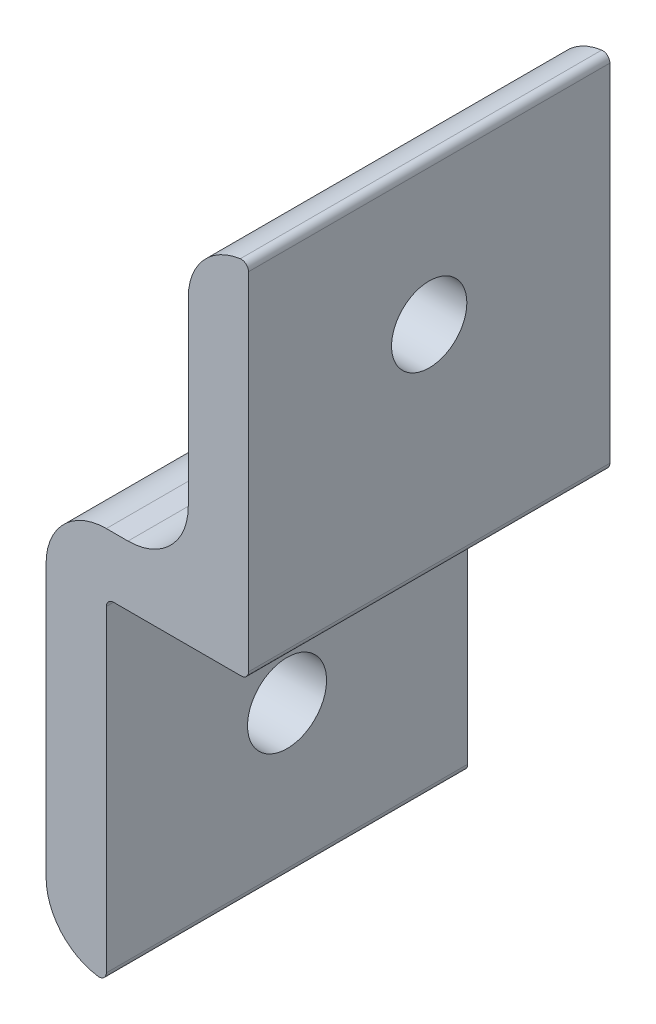
ISO-10303-21;
HEADER;
FILE_DESCRIPTION(('STEP AP214'),'2;1');
FILE_NAME('part.step','',(''),(''),'','','');
FILE_SCHEMA(('AUTOMOTIVE_DESIGN { 1 0 10303 214 1 1 1 1 }'));
ENDSEC;
DATA;
#1=APPLICATION_CONTEXT('core data for automotive mechanical design processes');
#2=APPLICATION_PROTOCOL_DEFINITION('international standard','automotive_design',2000,#1);
#3=PRODUCT_CONTEXT('',#1,'mechanical');
#4=PRODUCT('Part','Part','',(#3));
#5=PRODUCT_RELATED_PRODUCT_CATEGORY('part','',(#4));
#6=PRODUCT_DEFINITION_FORMATION('','',#4);
#7=PRODUCT_DEFINITION_CONTEXT('part definition',#1,'design');
#8=PRODUCT_DEFINITION('design','',#6,#7);
#9=PRODUCT_DEFINITION_SHAPE('','',#8);
#10=(LENGTH_UNIT() NAMED_UNIT(*) SI_UNIT(.MILLI.,.METRE.));
#11=(NAMED_UNIT(*) PLANE_ANGLE_UNIT() SI_UNIT($,.RADIAN.));
#12=(NAMED_UNIT(*) SI_UNIT($,.STERADIAN.) SOLID_ANGLE_UNIT());
#13=UNCERTAINTY_MEASURE_WITH_UNIT(LENGTH_MEASURE(1.E-05),#10,'distance_accuracy_value','');
#14=(GEOMETRIC_REPRESENTATION_CONTEXT(3) GLOBAL_UNCERTAINTY_ASSIGNED_CONTEXT((#13)) GLOBAL_UNIT_ASSIGNED_CONTEXT((#10,
#11,#12)) REPRESENTATION_CONTEXT('',''));
#15=CARTESIAN_POINT('',(0.,0.,0.));
#16=DIRECTION('',(0.,0.,1.));
#17=DIRECTION('',(1.,0.,0.));
#18=AXIS2_PLACEMENT_3D('',#15,#16,#17);
#19=CARTESIAN_POINT('',(-21.0747321003927,-66.5367807697173,38.1));
#20=DIRECTION('',(-1.,0.,0.));
#21=DIRECTION('',(0.,-1.,0.));
#22=AXIS2_PLACEMENT_3D('',#19,#20,#21);
#23=PLANE('',#22);
#24=CARTESIAN_POINT('',(-21.0747321003927,-56.9635207697173,19.05));
#25=DIRECTION('',(-1.,0.,0.));
#26=DIRECTION('',(0.,0.,1.));
#27=AXIS2_PLACEMENT_3D('',#24,#25,#26);
#28=CIRCLE('',#27,4.16560000000001);
#29=CARTESIAN_POINT('',(-21.0747321003927,-56.9635207697173,23.2156));
#30=VERTEX_POINT('',#29);
#31=EDGE_CURVE('E319',#30,#30,#28,.T.);
#32=ORIENTED_EDGE('',*,*,#31,.F.);
#33=EDGE_LOOP('',(#32));
#34=FACE_BOUND('',#33,.T.);
#35=DIRECTION('',(0.,1.,0.));
#36=VECTOR('',#35,1.);
#37=CARTESIAN_POINT('',(-21.0747321003927,-66.5367807697173,38.1));
#38=LINE('',#37,#36);
#39=CARTESIAN_POINT('',(-21.0747321003926,-66.5367807697173,38.1));
#40=VERTEX_POINT('',#39);
#41=CARTESIAN_POINT('',(-21.0747321003927,-37.8601807697173,38.1));
#42=VERTEX_POINT('',#41);
#43=EDGE_CURVE('E232',#40,#42,#38,.T.);
#44=ORIENTED_EDGE('',*,*,#43,.T.);
#45=DIRECTION('',(0.,0.,-1.));
#46=VECTOR('',#45,1.);
#47=CARTESIAN_POINT('',(-21.0747321003927,-37.8601807697173,38.1));
#48=LINE('',#47,#46);
#49=CARTESIAN_POINT('',(-21.0747321003926,-37.8601807697173,0.));
#50=VERTEX_POINT('',#49);
#51=EDGE_CURVE('E288',#42,#50,#48,.T.);
#52=ORIENTED_EDGE('',*,*,#51,.T.);
#53=DIRECTION('',(0.,1.,0.));
#54=VECTOR('',#53,1.);
#55=CARTESIAN_POINT('',(-21.0747321003927,-66.5367807697173,0.));
#56=LINE('',#55,#54);
#57=CARTESIAN_POINT('',(-21.0747321003926,-66.5367807697173,0.));
#58=VERTEX_POINT('',#57);
#59=EDGE_CURVE('E206',#58,#50,#56,.T.);
#60=ORIENTED_EDGE('',*,*,#59,.F.);
#61=DIRECTION('',(0.,0.,-1.));
#62=VECTOR('',#61,1.);
#63=CARTESIAN_POINT('',(-21.0747321003926,-66.5367807697173,38.1));
#64=LINE('',#63,#62);
#65=EDGE_CURVE('E181',#40,#58,#64,.T.);
#66=ORIENTED_EDGE('',*,*,#65,.F.);
#67=EDGE_LOOP('',(#44,#52,#60,#66));
#68=FACE_BOUND('',#67,.T.);
#69=ADVANCED_FACE('F38',(#34,#68),#23,.T.);
#70=CARTESIAN_POINT('',(-14.7247321003927,-66.5367807697173,38.1));
#71=DIRECTION('',(0.,0.,-1.));
#72=DIRECTION('',(0.,1.,0.));
#73=AXIS2_PLACEMENT_3D('',#70,#71,#72);
#74=CYLINDRICAL_SURFACE('',#73,6.34999999999999);
#75=CARTESIAN_POINT('',(-14.7247321003927,-66.5367807697173,0.));
#76=DIRECTION('',(0.,0.,-1.));
#77=DIRECTION('',(0.,1.,0.));
#78=AXIS2_PLACEMENT_3D('',#75,#76,#77);
#79=CIRCLE('',#78,6.34999999999999);
#80=CARTESIAN_POINT('',(-15.5906411913018,-72.8274644723271,0.));
#81=VERTEX_POINT('',#80);
#82=EDGE_CURVE('E230',#81,#58,#79,.T.);
#83=ORIENTED_EDGE('',*,*,#82,.F.);
#84=DIRECTION('',(0.,0.,-1.));
#85=VECTOR('',#84,1.);
#86=CARTESIAN_POINT('',(-15.5906411913018,-72.8274644723272,38.1));
#87=LINE('',#86,#85);
#88=CARTESIAN_POINT('',(-15.5906411913018,-72.8274644723272,38.1));
#89=VERTEX_POINT('',#88);
#90=EDGE_CURVE('E271',#81,#89,#87,.F.);
#91=ORIENTED_EDGE('',*,*,#90,.T.);
#92=CARTESIAN_POINT('',(-14.7247321003927,-66.5367807697173,38.1));
#93=DIRECTION('',(0.,0.,-1.));
#94=DIRECTION('',(0.,1.,0.));
#95=AXIS2_PLACEMENT_3D('',#92,#93,#94);
#96=CIRCLE('',#95,6.34999999999999);
#97=EDGE_CURVE('E182',#89,#40,#96,.T.);
#98=ORIENTED_EDGE('',*,*,#97,.T.);
#99=ORIENTED_EDGE('',*,*,#65,.T.);
#100=EDGE_LOOP('',(#83,#91,#98,#99));
#101=FACE_BOUND('',#100,.T.);
#102=ADVANCED_FACE('F328',(#101),#74,.T.);
#103=CARTESIAN_POINT('',(-14.7247321003927,-37.8601807697173,38.1));
#104=DIRECTION('',(1.,0.,0.));
#105=DIRECTION('',(0.,1.,0.));
#106=AXIS2_PLACEMENT_3D('',#103,#104,#105);
#107=PLANE('',#106);
#108=CARTESIAN_POINT('',(-14.7247321003927,-56.9635207697173,19.05));
#109=DIRECTION('',(1.,0.,0.));
#110=DIRECTION('',(0.,1.,0.));
#111=AXIS2_PLACEMENT_3D('',#108,#109,#110);
#112=CIRCLE('',#111,4.16560000000001);
#113=CARTESIAN_POINT('',(-14.7247321003927,-52.7979207697173,19.05));
#114=VERTEX_POINT('',#113);
#115=EDGE_CURVE('E315',#114,#114,#112,.T.);
#116=ORIENTED_EDGE('',*,*,#115,.F.);
#117=EDGE_LOOP('',(#116));
#118=FACE_BOUND('',#117,.T.);
#119=DIRECTION('',(0.,-1.,0.));
#120=VECTOR('',#119,1.);
#121=CARTESIAN_POINT('',(-14.7247321003927,-37.8601807697173,0.));
#122=LINE('',#121,#120);
#123=CARTESIAN_POINT('',(-14.7247321003927,-38.6221807697173,0.));
#124=VERTEX_POINT('',#123);
#125=CARTESIAN_POINT('',(-14.7247321003927,-72.0725824280139,0.));
#126=VERTEX_POINT('',#125);
#127=EDGE_CURVE('E226',#124,#126,#122,.T.);
#128=ORIENTED_EDGE('',*,*,#127,.F.);
#129=DIRECTION('',(0.,0.,-1.));
#130=VECTOR('',#129,1.);
#131=CARTESIAN_POINT('',(-14.7247321003927,-38.6221807697173,38.1));
#132=LINE('',#131,#130);
#133=CARTESIAN_POINT('',(-14.7247321003927,-38.6221807697173,38.1));
#134=VERTEX_POINT('',#133);
#135=EDGE_CURVE('E268',#124,#134,#132,.F.);
#136=ORIENTED_EDGE('',*,*,#135,.T.);
#137=DIRECTION('',(0.,-1.,0.));
#138=VECTOR('',#137,1.);
#139=CARTESIAN_POINT('',(-14.7247321003927,-37.8601807697173,38.1));
#140=LINE('',#139,#138);
#141=CARTESIAN_POINT('',(-14.7247321003927,-72.072582428014,38.1));
#142=VERTEX_POINT('',#141);
#143=EDGE_CURVE('E201',#134,#142,#140,.T.);
#144=ORIENTED_EDGE('',*,*,#143,.T.);
#145=DIRECTION('',(0.,0.,-1.));
#146=VECTOR('',#145,1.);
#147=CARTESIAN_POINT('',(-14.7247321003927,-72.072582428014,38.1));
#148=LINE('',#147,#146);
#149=EDGE_CURVE('E265',#142,#126,#148,.T.);
#150=ORIENTED_EDGE('',*,*,#149,.T.);
#151=EDGE_LOOP('',(#128,#136,#144,#150));
#152=FACE_BOUND('',#151,.T.);
#153=ADVANCED_FACE('F370',(#118,#152),#107,.T.);
#154=CARTESIAN_POINT('',(0.261267899607333,-37.8601807697173,38.1));
#155=DIRECTION('',(0.,-1.,0.));
#156=DIRECTION('',(0.,0.,-1.));
#157=AXIS2_PLACEMENT_3D('',#154,#155,#156);
#158=PLANE('',#157);
#159=DIRECTION('',(-1.,0.,0.));
#160=VECTOR('',#159,1.);
#161=CARTESIAN_POINT('',(0.261267899607336,-37.8601807697173,0.));
#162=LINE('',#161,#160);
#163=CARTESIAN_POINT('',(-0.500732100392664,-37.8601807697173,0.));
#164=VERTEX_POINT('',#163);
#165=CARTESIAN_POINT('',(-13.9627321003927,-37.8601807697173,0.));
#166=VERTEX_POINT('',#165);
#167=EDGE_CURVE('E222',#164,#166,#162,.T.);
#168=ORIENTED_EDGE('',*,*,#167,.F.);
#169=DIRECTION('',(0.,0.,-1.));
#170=VECTOR('',#169,1.);
#171=CARTESIAN_POINT('',(-0.500732100392667,-37.8601807697173,38.1));
#172=LINE('',#171,#170);
#173=CARTESIAN_POINT('',(-0.500732100392667,-37.8601807697173,38.1));
#174=VERTEX_POINT('',#173);
#175=EDGE_CURVE('E253',#164,#174,#172,.F.);
#176=ORIENTED_EDGE('',*,*,#175,.T.);
#177=DIRECTION('',(-1.,0.,0.));
#178=VECTOR('',#177,1.);
#179=CARTESIAN_POINT('',(0.261267899607333,-37.8601807697173,38.1));
#180=LINE('',#179,#178);
#181=CARTESIAN_POINT('',(-13.9627321003927,-37.8601807697173,38.1));
#182=VERTEX_POINT('',#181);
#183=EDGE_CURVE('E194',#174,#182,#180,.T.);
#184=ORIENTED_EDGE('',*,*,#183,.T.);
#185=DIRECTION('',(0.,0.,-1.));
#186=VECTOR('',#185,1.);
#187=CARTESIAN_POINT('',(-13.9627321003927,-37.8601807697173,0.));
#188=LINE('',#187,#186);
#189=EDGE_CURVE('E249',#182,#166,#188,.T.);
#190=ORIENTED_EDGE('',*,*,#189,.T.);
#191=EDGE_LOOP('',(#168,#176,#184,#190));
#192=FACE_BOUND('',#191,.T.);
#193=ADVANCED_FACE('F366',(#192),#158,.T.);
#194=CARTESIAN_POINT('',(0.261267899607339,0.2398192302827,38.1));
#195=DIRECTION('',(1.,0.,0.));
#196=DIRECTION('',(0.,1.,0.));
#197=AXIS2_PLACEMENT_3D('',#194,#195,#196);
#198=PLANE('',#197);
#199=CARTESIAN_POINT('',(0.261267899607339,-14.9062007697173,19.05));
#200=DIRECTION('',(1.,0.,0.));
#201=DIRECTION('',(0.,0.,-1.));
#202=AXIS2_PLACEMENT_3D('',#199,#200,#201);
#203=CIRCLE('',#202,3.96874999999999);
#204=CARTESIAN_POINT('',(0.261267899607339,-14.9062007697173,15.08125));
#205=VERTEX_POINT('',#204);
#206=EDGE_CURVE('E311',#205,#205,#203,.T.);
#207=ORIENTED_EDGE('',*,*,#206,.F.);
#208=EDGE_LOOP('',(#207));
#209=FACE_BOUND('',#208,.T.);
#210=DIRECTION('',(0.,-1.,0.));
#211=VECTOR('',#210,1.);
#212=CARTESIAN_POINT('',(0.261267899607339,0.2398192302827,38.1));
#213=LINE('',#212,#211);
#214=CARTESIAN_POINT('',(0.261267899607339,-0.574379111420643,38.1));
#215=VERTEX_POINT('',#214);
#216=CARTESIAN_POINT('',(0.261267899607333,-37.0981807697173,38.1));
#217=VERTEX_POINT('',#216);
#218=EDGE_CURVE('E189',#215,#217,#213,.T.);
#219=ORIENTED_EDGE('',*,*,#218,.T.);
#220=DIRECTION('',(0.,0.,-1.));
#221=VECTOR('',#220,1.);
#222=CARTESIAN_POINT('',(0.261267899607333,-37.0981807697173,38.1));
#223=LINE('',#222,#221);
#224=CARTESIAN_POINT('',(0.261267899607336,-37.0981807697173,0.));
#225=VERTEX_POINT('',#224);
#226=EDGE_CURVE('E238',#217,#225,#223,.T.);
#227=ORIENTED_EDGE('',*,*,#226,.T.);
#228=DIRECTION('',(0.,-1.,0.));
#229=VECTOR('',#228,1.);
#230=CARTESIAN_POINT('',(0.261267899607342,0.239819230282717,0.));
#231=LINE('',#230,#229);
#232=CARTESIAN_POINT('',(0.261267899607342,-0.574379111420627,0.));
#233=VERTEX_POINT('',#232);
#234=EDGE_CURVE('E218',#233,#225,#231,.T.);
#235=ORIENTED_EDGE('',*,*,#234,.F.);
#236=DIRECTION('',(0.,0.,-1.));
#237=VECTOR('',#236,1.);
#238=CARTESIAN_POINT('',(0.261267899607339,-0.574379111420643,38.1));
#239=LINE('',#238,#237);
#240=EDGE_CURVE('E234',#233,#215,#239,.F.);
#241=ORIENTED_EDGE('',*,*,#240,.T.);
#242=EDGE_LOOP('',(#219,#227,#235,#241));
#243=FACE_BOUND('',#242,.T.);
#244=ADVANCED_FACE('F363',(#209,#243),#198,.T.);
#245=CARTESIAN_POINT('',(0.261267899607341,-6.1101807697173,38.1));
#246=DIRECTION('',(0.,0.,-1.));
#247=DIRECTION('',(0.,1.,0.));
#248=AXIS2_PLACEMENT_3D('',#245,#246,#247);
#249=CYLINDRICAL_SURFACE('',#248,6.35);
#250=CARTESIAN_POINT('',(0.261267899607341,-6.1101807697173,38.1));
#251=DIRECTION('',(0.,0.,-1.));
#252=DIRECTION('',(0.,1.,0.));
#253=AXIS2_PLACEMENT_3D('',#250,#251,#252);
#254=CIRCLE('',#253,6.35);
#255=CARTESIAN_POINT('',(-6.08873210039266,-6.1101807697173,38.1));
#256=VERTEX_POINT('',#255);
#257=CARTESIAN_POINT('',(-0.604641191301752,0.180502932892537,38.1));
#258=VERTEX_POINT('',#257);
#259=EDGE_CURVE('E170',#256,#258,#254,.T.);
#260=ORIENTED_EDGE('',*,*,#259,.T.);
#261=DIRECTION('',(0.,0.,-1.));
#262=VECTOR('',#261,1.);
#263=CARTESIAN_POINT('',(-0.604641191301753,0.180502932892538,38.1));
#264=LINE('',#263,#262);
#265=CARTESIAN_POINT('',(-0.60464119130175,0.180502932892555,0.));
#266=VERTEX_POINT('',#265);
#267=EDGE_CURVE('E262',#258,#266,#264,.T.);
#268=ORIENTED_EDGE('',*,*,#267,.T.);
#269=CARTESIAN_POINT('',(0.261267899607344,-6.11018076971728,0.));
#270=DIRECTION('',(0.,0.,-1.));
#271=DIRECTION('',(0.,1.,0.));
#272=AXIS2_PLACEMENT_3D('',#269,#270,#271);
#273=CIRCLE('',#272,6.35);
#274=CARTESIAN_POINT('',(-6.08873210039266,-6.11018076971728,0.));
#275=VERTEX_POINT('',#274);
#276=EDGE_CURVE('E179',#275,#266,#273,.T.);
#277=ORIENTED_EDGE('',*,*,#276,.F.);
#278=DIRECTION('',(0.,0.,-1.));
#279=VECTOR('',#278,1.);
#280=CARTESIAN_POINT('',(-6.08873210039266,-6.1101807697173,38.1));
#281=LINE('',#280,#279);
#282=EDGE_CURVE('E163',#256,#275,#281,.T.);
#283=ORIENTED_EDGE('',*,*,#282,.F.);
#284=EDGE_LOOP('',(#260,#268,#277,#283));
#285=FACE_BOUND('',#284,.T.);
#286=ADVANCED_FACE('F175',(#285),#249,.T.);
#287=CARTESIAN_POINT('',(-6.08873210039266,-31.5101807697173,38.1));
#288=DIRECTION('',(-1.,0.,0.));
#289=DIRECTION('',(0.,-1.,0.));
#290=AXIS2_PLACEMENT_3D('',#287,#288,#289);
#291=PLANE('',#290);
#292=CARTESIAN_POINT('',(-6.08873210039266,-14.9062007697173,19.05));
#293=DIRECTION('',(-1.,0.,0.));
#294=DIRECTION('',(0.,-1.,0.));
#295=AXIS2_PLACEMENT_3D('',#292,#293,#294);
#296=CIRCLE('',#295,3.96874999999999);
#297=CARTESIAN_POINT('',(-6.08873210039266,-18.8749507697173,19.05));
#298=VERTEX_POINT('',#297);
#299=EDGE_CURVE('E211',#298,#298,#296,.T.);
#300=ORIENTED_EDGE('',*,*,#299,.F.);
#301=EDGE_LOOP('',(#300));
#302=FACE_BOUND('',#301,.T.);
#303=DIRECTION('',(0.,1.,0.));
#304=VECTOR('',#303,1.);
#305=CARTESIAN_POINT('',(-6.08873210039266,-31.5101807697173,0.));
#306=LINE('',#305,#304);
#307=CARTESIAN_POINT('',(-6.08873210039266,-25.1601807697173,0.));
#308=VERTEX_POINT('',#307);
#309=EDGE_CURVE('E214',#308,#275,#306,.T.);
#310=ORIENTED_EDGE('',*,*,#309,.F.);
#311=DIRECTION('',(0.,0.,-1.));
#312=VECTOR('',#311,1.);
#313=CARTESIAN_POINT('',(-6.08873210039266,-25.1601807697173,38.1));
#314=LINE('',#313,#312);
#315=CARTESIAN_POINT('',(-6.08873210039266,-25.1601807697173,38.1));
#316=VERTEX_POINT('',#315);
#317=EDGE_CURVE('E166',#308,#316,#314,.F.);
#318=ORIENTED_EDGE('',*,*,#317,.T.);
#319=DIRECTION('',(0.,1.,0.));
#320=VECTOR('',#319,1.);
#321=CARTESIAN_POINT('',(-6.08873210039266,-31.5101807697173,38.1));
#322=LINE('',#321,#320);
#323=EDGE_CURVE('E159',#316,#256,#322,.T.);
#324=ORIENTED_EDGE('',*,*,#323,.T.);
#325=ORIENTED_EDGE('',*,*,#282,.T.);
#326=EDGE_LOOP('',(#310,#318,#324,#325));
#327=FACE_BOUND('',#326,.T.);
#328=ADVANCED_FACE('F162',(#302,#327),#291,.T.);
#329=CARTESIAN_POINT('',(-21.0747321003927,-31.5101807697173,38.1));
#330=DIRECTION('',(0.,1.,0.));
#331=DIRECTION('',(0.,0.,1.));
#332=AXIS2_PLACEMENT_3D('',#329,#330,#331);
#333=PLANE('',#332);
#334=DIRECTION('',(1.,0.,0.));
#335=VECTOR('',#334,1.);
#336=CARTESIAN_POINT('',(-21.0747321003927,-31.5101807697173,38.1));
#337=LINE('',#336,#335);
#338=CARTESIAN_POINT('',(-14.7247321003927,-31.5101807697173,38.1));
#339=VERTEX_POINT('',#338);
#340=CARTESIAN_POINT('',(-12.4387321003927,-31.5101807697173,38.1));
#341=VERTEX_POINT('',#340);
#342=EDGE_CURVE('E171',#339,#341,#337,.T.);
#343=ORIENTED_EDGE('',*,*,#342,.T.);
#344=DIRECTION('',(0.,0.,-1.));
#345=VECTOR('',#344,1.);
#346=CARTESIAN_POINT('',(-12.4387321003927,-31.5101807697173,0.));
#347=LINE('',#346,#345);
#348=CARTESIAN_POINT('',(-12.4387321003927,-31.5101807697173,0.));
#349=VERTEX_POINT('',#348);
#350=EDGE_CURVE('E282',#341,#349,#347,.T.);
#351=ORIENTED_EDGE('',*,*,#350,.T.);
#352=DIRECTION('',(1.,0.,0.));
#353=VECTOR('',#352,1.);
#354=CARTESIAN_POINT('',(-21.0747321003926,-31.5101807697173,0.));
#355=LINE('',#354,#353);
#356=CARTESIAN_POINT('',(-14.7247321003927,-31.5101807697173,0.));
#357=VERTEX_POINT('',#356);
#358=EDGE_CURVE('E210',#357,#349,#355,.T.);
#359=ORIENTED_EDGE('',*,*,#358,.F.);
#360=DIRECTION('',(0.,0.,-1.));
#361=VECTOR('',#360,1.);
#362=CARTESIAN_POINT('',(-14.7247321003927,-31.5101807697173,38.1));
#363=LINE('',#362,#361);
#364=EDGE_CURVE('E279',#357,#339,#363,.F.);
#365=ORIENTED_EDGE('',*,*,#364,.T.);
#366=EDGE_LOOP('',(#343,#351,#359,#365));
#367=FACE_BOUND('',#366,.T.);
#368=ADVANCED_FACE('F304',(#367),#333,.T.);
#369=CARTESIAN_POINT('',(0.261267899607341,-6.1101807697173,38.1));
#370=DIRECTION('',(0.,0.,-1.));
#371=DIRECTION('',(0.,1.,0.));
#372=AXIS2_PLACEMENT_3D('',#369,#370,#371);
#373=PLANE('',#372);
#374=ORIENTED_EDGE('',*,*,#342,.F.);
#375=CARTESIAN_POINT('',(-14.7247321003927,-37.8601807697173,38.1));
#376=DIRECTION('',(0.,0.,-1.));
#377=DIRECTION('',(0.,1.,0.));
#378=AXIS2_PLACEMENT_3D('',#375,#376,#377);
#379=CIRCLE('',#378,6.35);
#380=EDGE_CURVE('E56',#339,#42,#379,.F.);
#381=ORIENTED_EDGE('',*,*,#380,.T.);
#382=ORIENTED_EDGE('',*,*,#43,.F.);
#383=ORIENTED_EDGE('',*,*,#97,.F.);
#384=CARTESIAN_POINT('',(-15.4867321003927,-72.072582428014,38.1));
#385=DIRECTION('',(0.,0.,-1.));
#386=DIRECTION('',(0.,1.,0.));
#387=AXIS2_PLACEMENT_3D('',#384,#385,#386);
#388=CIRCLE('',#387,0.762);
#389=EDGE_CURVE('E256',#89,#142,#388,.F.);
#390=ORIENTED_EDGE('',*,*,#389,.T.);
#391=ORIENTED_EDGE('',*,*,#143,.F.);
#392=CARTESIAN_POINT('',(-13.9627321003927,-38.6221807697173,38.1));
#393=DIRECTION('',(0.,0.,-1.));
#394=DIRECTION('',(0.,1.,0.));
#395=AXIS2_PLACEMENT_3D('',#392,#393,#394);
#396=CIRCLE('',#395,0.762);
#397=EDGE_CURVE('E276',#134,#182,#396,.T.);
#398=ORIENTED_EDGE('',*,*,#397,.T.);
#399=ORIENTED_EDGE('',*,*,#183,.F.);
#400=CARTESIAN_POINT('',(-0.500732100392667,-37.0981807697173,38.1));
#401=DIRECTION('',(0.,0.,-1.));
#402=DIRECTION('',(0.,1.,0.));
#403=AXIS2_PLACEMENT_3D('',#400,#401,#402);
#404=CIRCLE('',#403,0.762);
#405=EDGE_CURVE('E259',#174,#217,#404,.F.);
#406=ORIENTED_EDGE('',*,*,#405,.T.);
#407=ORIENTED_EDGE('',*,*,#218,.F.);
#408=CARTESIAN_POINT('',(-0.500732100392661,-0.574379111420643,38.1));
#409=DIRECTION('',(0.,0.,-1.));
#410=DIRECTION('',(0.,1.,0.));
#411=AXIS2_PLACEMENT_3D('',#408,#409,#410);
#412=CIRCLE('',#411,0.762);
#413=EDGE_CURVE('E187',#215,#258,#412,.F.);
#414=ORIENTED_EDGE('',*,*,#413,.T.);
#415=ORIENTED_EDGE('',*,*,#259,.F.);
#416=ORIENTED_EDGE('',*,*,#323,.F.);
#417=CARTESIAN_POINT('',(-12.4387321003927,-25.1601807697173,38.1));
#418=DIRECTION('',(0.,0.,-1.));
#419=DIRECTION('',(0.,1.,0.));
#420=AXIS2_PLACEMENT_3D('',#417,#418,#419);
#421=CIRCLE('',#420,6.35);
#422=EDGE_CURVE('E11',#316,#341,#421,.T.);
#423=ORIENTED_EDGE('',*,*,#422,.T.);
#424=EDGE_LOOP('',(#374,#381,#382,#383,#390,#391,#398,#399,#406,#407,#414,#415,#416,#423));
#425=FACE_BOUND('',#424,.T.);
#426=ADVANCED_FACE('F184',(#425),#373,.F.);
#427=CARTESIAN_POINT('',(0.261267899607344,-6.11018076971728,0.));
#428=DIRECTION('',(0.,0.,-1.));
#429=DIRECTION('',(0.,1.,0.));
#430=AXIS2_PLACEMENT_3D('',#427,#428,#429);
#431=PLANE('',#430);
#432=ORIENTED_EDGE('',*,*,#59,.T.);
#433=CARTESIAN_POINT('',(-14.7247321003927,-37.8601807697173,0.));
#434=DIRECTION('',(0.,0.,-1.));
#435=DIRECTION('',(0.,1.,0.));
#436=AXIS2_PLACEMENT_3D('',#433,#434,#435);
#437=CIRCLE('',#436,6.35);
#438=EDGE_CURVE('E65',#50,#357,#437,.T.);
#439=ORIENTED_EDGE('',*,*,#438,.T.);
#440=ORIENTED_EDGE('',*,*,#358,.T.);
#441=CARTESIAN_POINT('',(-12.4387321003927,-25.1601807697173,0.));
#442=DIRECTION('',(0.,0.,-1.));
#443=DIRECTION('',(0.,1.,0.));
#444=AXIS2_PLACEMENT_3D('',#441,#442,#443);
#445=CIRCLE('',#444,6.35);
#446=EDGE_CURVE('E47',#349,#308,#445,.F.);
#447=ORIENTED_EDGE('',*,*,#446,.T.);
#448=ORIENTED_EDGE('',*,*,#309,.T.);
#449=ORIENTED_EDGE('',*,*,#276,.T.);
#450=CARTESIAN_POINT('',(-0.500732100392658,-0.574379111420626,0.));
#451=DIRECTION('',(0.,0.,-1.));
#452=DIRECTION('',(0.,1.,0.));
#453=AXIS2_PLACEMENT_3D('',#450,#451,#452);
#454=CIRCLE('',#453,0.762);
#455=EDGE_CURVE('E244',#266,#233,#454,.T.);
#456=ORIENTED_EDGE('',*,*,#455,.T.);
#457=ORIENTED_EDGE('',*,*,#234,.T.);
#458=CARTESIAN_POINT('',(-0.500732100392664,-37.0981807697173,0.));
#459=DIRECTION('',(0.,0.,-1.));
#460=DIRECTION('',(0.,1.,0.));
#461=AXIS2_PLACEMENT_3D('',#458,#459,#460);
#462=CIRCLE('',#461,0.762);
#463=EDGE_CURVE('E246',#225,#164,#462,.T.);
#464=ORIENTED_EDGE('',*,*,#463,.T.);
#465=ORIENTED_EDGE('',*,*,#167,.T.);
#466=CARTESIAN_POINT('',(-13.9627321003927,-38.6221807697173,0.));
#467=DIRECTION('',(0.,0.,-1.));
#468=DIRECTION('',(0.,1.,0.));
#469=AXIS2_PLACEMENT_3D('',#466,#467,#468);
#470=CIRCLE('',#469,0.762);
#471=EDGE_CURVE('E273',#166,#124,#470,.F.);
#472=ORIENTED_EDGE('',*,*,#471,.T.);
#473=ORIENTED_EDGE('',*,*,#127,.T.);
#474=CARTESIAN_POINT('',(-15.4867321003927,-72.072582428014,0.));
#475=DIRECTION('',(0.,0.,-1.));
#476=DIRECTION('',(0.,1.,0.));
#477=AXIS2_PLACEMENT_3D('',#474,#475,#476);
#478=CIRCLE('',#477,0.762);
#479=EDGE_CURVE('E242',#126,#81,#478,.T.);
#480=ORIENTED_EDGE('',*,*,#479,.T.);
#481=ORIENTED_EDGE('',*,*,#82,.T.);
#482=EDGE_LOOP('',(#432,#439,#440,#447,#448,#449,#456,#457,#464,#465,#472,#473,#480,#481));
#483=FACE_BOUND('',#482,.T.);
#484=ADVANCED_FACE('F297',(#483),#431,.T.);
#485=CARTESIAN_POINT('',(0.261267899607338,-14.9062007697173,19.05));
#486=DIRECTION('',(1.,0.,0.));
#487=DIRECTION('',(0.,0.,-1.));
#488=AXIS2_PLACEMENT_3D('',#485,#486,#487);
#489=CYLINDRICAL_SURFACE('',#488,3.96874999999999);
#490=ORIENTED_EDGE('',*,*,#299,.T.);
#491=EDGE_LOOP('',(#490));
#492=FACE_BOUND('',#491,.T.);
#493=ORIENTED_EDGE('',*,*,#206,.T.);
#494=EDGE_LOOP('',(#493));
#495=FACE_BOUND('',#494,.T.);
#496=ADVANCED_FACE('F380',(#492,#495),#489,.F.);
#497=CARTESIAN_POINT('',(-21.0747321003927,-56.9635207697173,19.05));
#498=DIRECTION('',(-1.,0.,0.));
#499=DIRECTION('',(0.,0.,1.));
#500=AXIS2_PLACEMENT_3D('',#497,#498,#499);
#501=CYLINDRICAL_SURFACE('',#500,4.16560000000001);
#502=ORIENTED_EDGE('',*,*,#115,.T.);
#503=EDGE_LOOP('',(#502));
#504=FACE_BOUND('',#503,.T.);
#505=ORIENTED_EDGE('',*,*,#31,.T.);
#506=EDGE_LOOP('',(#505));
#507=FACE_BOUND('',#506,.T.);
#508=ADVANCED_FACE('F324',(#504,#507),#501,.F.);
#509=CARTESIAN_POINT('',(-0.500732100392667,-37.0981807697173,38.1));
#510=DIRECTION('',(0.,0.,-1.));
#511=DIRECTION('',(0.,1.,0.));
#512=AXIS2_PLACEMENT_3D('',#509,#510,#511);
#513=CYLINDRICAL_SURFACE('',#512,0.762);
#514=ORIENTED_EDGE('',*,*,#405,.F.);
#515=ORIENTED_EDGE('',*,*,#175,.F.);
#516=ORIENTED_EDGE('',*,*,#463,.F.);
#517=ORIENTED_EDGE('',*,*,#226,.F.);
#518=EDGE_LOOP('',(#514,#515,#516,#517));
#519=FACE_BOUND('',#518,.T.);
#520=ADVANCED_FACE('F351',(#519),#513,.T.);
#521=CARTESIAN_POINT('',(-0.500732100392661,-0.574379111420643,38.1));
#522=DIRECTION('',(0.,0.,-1.));
#523=DIRECTION('',(0.,1.,0.));
#524=AXIS2_PLACEMENT_3D('',#521,#522,#523);
#525=CYLINDRICAL_SURFACE('',#524,0.762);
#526=ORIENTED_EDGE('',*,*,#413,.F.);
#527=ORIENTED_EDGE('',*,*,#240,.F.);
#528=ORIENTED_EDGE('',*,*,#455,.F.);
#529=ORIENTED_EDGE('',*,*,#267,.F.);
#530=EDGE_LOOP('',(#526,#527,#528,#529));
#531=FACE_BOUND('',#530,.T.);
#532=ADVANCED_FACE('F347',(#531),#525,.T.);
#533=CARTESIAN_POINT('',(-13.9627321003927,-38.6221807697173,38.1));
#534=DIRECTION('',(0.,0.,1.));
#535=DIRECTION('',(0.,-1.,0.));
#536=AXIS2_PLACEMENT_3D('',#533,#534,#535);
#537=CYLINDRICAL_SURFACE('',#536,0.762);
#538=ORIENTED_EDGE('',*,*,#397,.F.);
#539=ORIENTED_EDGE('',*,*,#135,.F.);
#540=ORIENTED_EDGE('',*,*,#471,.F.);
#541=ORIENTED_EDGE('',*,*,#189,.F.);
#542=EDGE_LOOP('',(#538,#539,#540,#541));
#543=FACE_BOUND('',#542,.T.);
#544=ADVANCED_FACE('F341',(#543),#537,.F.);
#545=CARTESIAN_POINT('',(-15.4867321003927,-72.072582428014,38.1));
#546=DIRECTION('',(0.,0.,-1.));
#547=DIRECTION('',(0.,1.,0.));
#548=AXIS2_PLACEMENT_3D('',#545,#546,#547);
#549=CYLINDRICAL_SURFACE('',#548,0.762);
#550=ORIENTED_EDGE('',*,*,#389,.F.);
#551=ORIENTED_EDGE('',*,*,#90,.F.);
#552=ORIENTED_EDGE('',*,*,#479,.F.);
#553=ORIENTED_EDGE('',*,*,#149,.F.);
#554=EDGE_LOOP('',(#550,#551,#552,#553));
#555=FACE_BOUND('',#554,.T.);
#556=ADVANCED_FACE('F337',(#555),#549,.T.);
#557=CARTESIAN_POINT('',(-12.4387321003927,-25.1601807697173,38.1));
#558=DIRECTION('',(0.,0.,1.));
#559=DIRECTION('',(0.,-1.,0.));
#560=AXIS2_PLACEMENT_3D('',#557,#558,#559);
#561=CYLINDRICAL_SURFACE('',#560,6.35);
#562=ORIENTED_EDGE('',*,*,#422,.F.);
#563=ORIENTED_EDGE('',*,*,#317,.F.);
#564=ORIENTED_EDGE('',*,*,#446,.F.);
#565=ORIENTED_EDGE('',*,*,#350,.F.);
#566=EDGE_LOOP('',(#562,#563,#564,#565));
#567=FACE_BOUND('',#566,.T.);
#568=ADVANCED_FACE('F301',(#567),#561,.F.);
#569=CARTESIAN_POINT('',(-14.7247321003927,-37.8601807697173,38.1));
#570=DIRECTION('',(0.,0.,-1.));
#571=DIRECTION('',(0.,1.,0.));
#572=AXIS2_PLACEMENT_3D('',#569,#570,#571);
#573=CYLINDRICAL_SURFACE('',#572,6.35);
#574=ORIENTED_EDGE('',*,*,#380,.F.);
#575=ORIENTED_EDGE('',*,*,#364,.F.);
#576=ORIENTED_EDGE('',*,*,#438,.F.);
#577=ORIENTED_EDGE('',*,*,#51,.F.);
#578=EDGE_LOOP('',(#574,#575,#576,#577));
#579=FACE_BOUND('',#578,.T.);
#580=ADVANCED_FACE('F40',(#579),#573,.T.);
#581=CLOSED_SHELL('',(#69,#102,#153,#193,#244,#286,#328,#368,#426,#484,#496,#508,#520,#532,#544,
#556,#568,#580));
#582=MANIFOLD_SOLID_BREP('B2',#581);
#583=ADVANCED_BREP_SHAPE_REPRESENTATION('',(#18,#582),#14);
#584=SHAPE_DEFINITION_REPRESENTATION(#9,#583);
ENDSEC;
END-ISO-10303-21;
